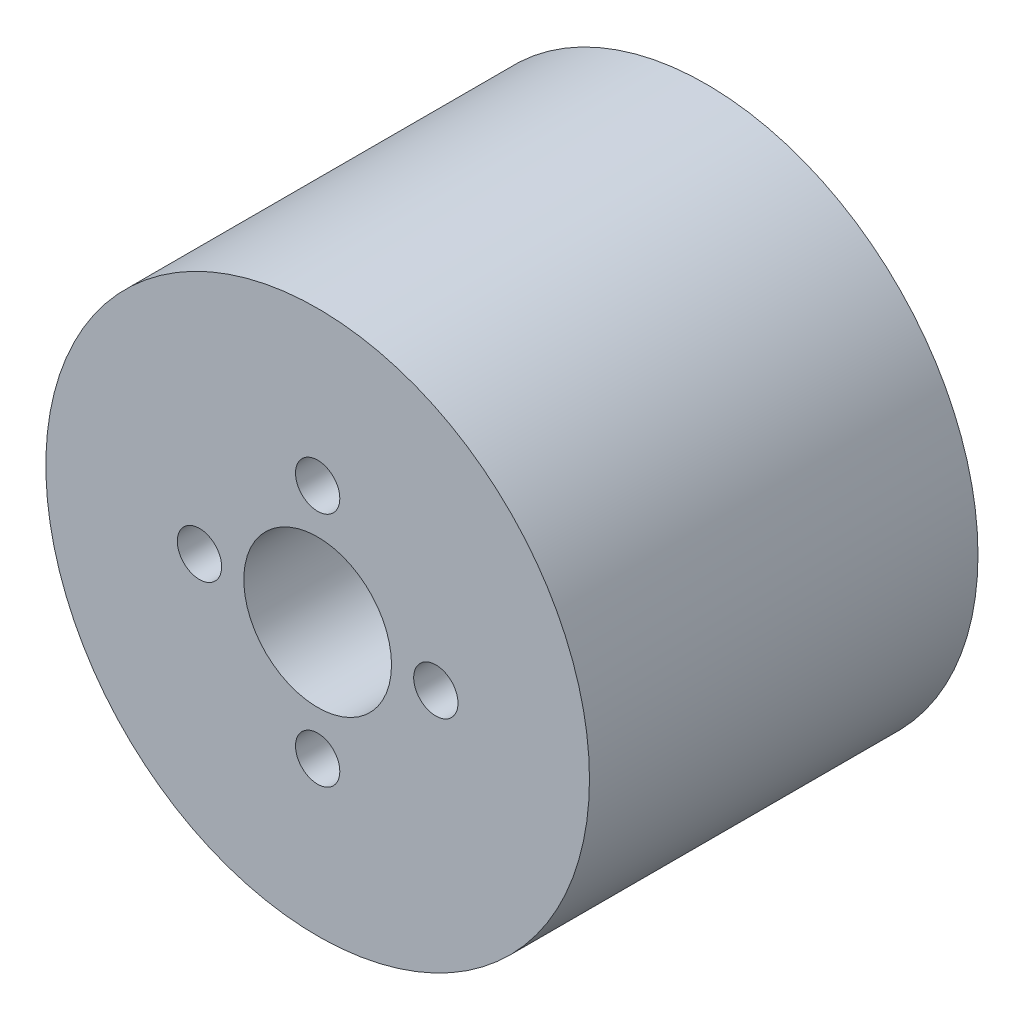
ISO-10303-21;
HEADER;
FILE_DESCRIPTION(('STEP AP214'),'2;1');
FILE_NAME('part.step','',(''),(''),'','','');
FILE_SCHEMA(('AUTOMOTIVE_DESIGN { 1 0 10303 214 1 1 1 1 }'));
ENDSEC;
DATA;
#1=APPLICATION_CONTEXT('core data for automotive mechanical design processes');
#2=APPLICATION_PROTOCOL_DEFINITION('international standard','automotive_design',2000,#1);
#3=PRODUCT_CONTEXT('',#1,'mechanical');
#4=PRODUCT('Part','Part','',(#3));
#5=PRODUCT_RELATED_PRODUCT_CATEGORY('part','',(#4));
#6=PRODUCT_DEFINITION_FORMATION('','',#4);
#7=PRODUCT_DEFINITION_CONTEXT('part definition',#1,'design');
#8=PRODUCT_DEFINITION('design','',#6,#7);
#9=PRODUCT_DEFINITION_SHAPE('','',#8);
#10=(LENGTH_UNIT() NAMED_UNIT(*) SI_UNIT(.MILLI.,.METRE.));
#11=(NAMED_UNIT(*) PLANE_ANGLE_UNIT() SI_UNIT($,.RADIAN.));
#12=(NAMED_UNIT(*) SI_UNIT($,.STERADIAN.) SOLID_ANGLE_UNIT());
#13=UNCERTAINTY_MEASURE_WITH_UNIT(LENGTH_MEASURE(1.E-05),#10,'distance_accuracy_value','');
#14=(GEOMETRIC_REPRESENTATION_CONTEXT(3) GLOBAL_UNCERTAINTY_ASSIGNED_CONTEXT((#13)) GLOBAL_UNIT_ASSIGNED_CONTEXT((#10,
#11,#12)) REPRESENTATION_CONTEXT('',''));
#15=CARTESIAN_POINT('',(0.,0.,0.));
#16=DIRECTION('',(0.,0.,1.));
#17=DIRECTION('',(1.,0.,0.));
#18=AXIS2_PLACEMENT_3D('',#15,#16,#17);
#19=CARTESIAN_POINT('',(0.,0.,26.3));
#20=DIRECTION('',(0.,0.,-1.));
#21=DIRECTION('',(-1.,0.,0.));
#22=AXIS2_PLACEMENT_3D('',#19,#20,#21);
#23=CYLINDRICAL_SURFACE('',#22,18.4);
#24=CARTESIAN_POINT('',(0.,0.,26.3));
#25=DIRECTION('',(0.,0.,1.));
#26=DIRECTION('',(1.,0.,0.));
#27=AXIS2_PLACEMENT_3D('',#24,#25,#26);
#28=CIRCLE('',#27,18.4);
#29=CARTESIAN_POINT('',(18.4,0.,26.3));
#30=VERTEX_POINT('',#29);
#31=EDGE_CURVE('E10',#30,#30,#28,.T.);
#32=ORIENTED_EDGE('',*,*,#31,.F.);
#33=EDGE_LOOP('',(#32));
#34=FACE_BOUND('',#33,.T.);
#35=CARTESIAN_POINT('',(0.,0.,0.));
#36=DIRECTION('',(0.,0.,1.));
#37=DIRECTION('',(1.,0.,0.));
#38=AXIS2_PLACEMENT_3D('',#35,#36,#37);
#39=CIRCLE('',#38,18.4);
#40=CARTESIAN_POINT('',(18.4,0.,0.));
#41=VERTEX_POINT('',#40);
#42=EDGE_CURVE('E38',#41,#41,#39,.T.);
#43=ORIENTED_EDGE('',*,*,#42,.T.);
#44=EDGE_LOOP('',(#43));
#45=FACE_BOUND('',#44,.T.);
#46=ADVANCED_FACE('F31',(#34,#45),#23,.T.);
#47=CARTESIAN_POINT('',(0.,0.,26.3));
#48=DIRECTION('',(0.,0.,1.));
#49=DIRECTION('',(1.,0.,0.));
#50=AXIS2_PLACEMENT_3D('',#47,#48,#49);
#51=PLANE('',#50);
#52=CARTESIAN_POINT('',(0.,0.,26.3));
#53=DIRECTION('',(0.,0.,1.));
#54=DIRECTION('',(1.,0.,0.));
#55=AXIS2_PLACEMENT_3D('',#52,#53,#54);
#56=CIRCLE('',#55,5.);
#57=CARTESIAN_POINT('',(5.,0.,26.3));
#58=VERTEX_POINT('',#57);
#59=EDGE_CURVE('E68',#58,#58,#56,.T.);
#60=ORIENTED_EDGE('',*,*,#59,.F.);
#61=EDGE_LOOP('',(#60));
#62=FACE_BOUND('',#61,.T.);
#63=CARTESIAN_POINT('',(0.,8.,26.3));
#64=DIRECTION('',(0.,0.,1.));
#65=DIRECTION('',(1.,0.,0.));
#66=AXIS2_PLACEMENT_3D('',#63,#64,#65);
#67=CIRCLE('',#66,1.5);
#68=CARTESIAN_POINT('',(1.5,8.,26.3));
#69=VERTEX_POINT('',#68);
#70=EDGE_CURVE('E63',#69,#69,#67,.T.);
#71=ORIENTED_EDGE('',*,*,#70,.F.);
#72=EDGE_LOOP('',(#71));
#73=FACE_BOUND('',#72,.T.);
#74=CARTESIAN_POINT('',(8.,0.,26.3));
#75=DIRECTION('',(0.,0.,1.));
#76=DIRECTION('',(1.,0.,0.));
#77=AXIS2_PLACEMENT_3D('',#74,#75,#76);
#78=CIRCLE('',#77,1.5);
#79=CARTESIAN_POINT('',(9.5,0.,26.3));
#80=VERTEX_POINT('',#79);
#81=EDGE_CURVE('E57',#80,#80,#78,.T.);
#82=ORIENTED_EDGE('',*,*,#81,.F.);
#83=EDGE_LOOP('',(#82));
#84=FACE_BOUND('',#83,.T.);
#85=CARTESIAN_POINT('',(4.52787916007828E-13,-8.,26.3));
#86=DIRECTION('',(0.,0.,1.));
#87=DIRECTION('',(1.,0.,0.));
#88=AXIS2_PLACEMENT_3D('',#85,#86,#87);
#89=CIRCLE('',#88,1.50000000000049);
#90=CARTESIAN_POINT('',(1.50000000000094,-8.,26.3));
#91=VERTEX_POINT('',#90);
#92=EDGE_CURVE('E51',#91,#91,#89,.T.);
#93=ORIENTED_EDGE('',*,*,#92,.F.);
#94=EDGE_LOOP('',(#93));
#95=FACE_BOUND('',#94,.T.);
#96=CARTESIAN_POINT('',(-8.,0.,26.3));
#97=DIRECTION('',(0.,0.,1.));
#98=DIRECTION('',(1.,0.,0.));
#99=AXIS2_PLACEMENT_3D('',#96,#97,#98);
#100=CIRCLE('',#99,1.5);
#101=CARTESIAN_POINT('',(-6.5,0.,26.3));
#102=VERTEX_POINT('',#101);
#103=EDGE_CURVE('E45',#102,#102,#100,.T.);
#104=ORIENTED_EDGE('',*,*,#103,.F.);
#105=EDGE_LOOP('',(#104));
#106=FACE_BOUND('',#105,.T.);
#107=ORIENTED_EDGE('',*,*,#31,.T.);
#108=EDGE_LOOP('',(#107));
#109=FACE_BOUND('',#108,.T.);
#110=ADVANCED_FACE('F109',(#62,#73,#84,#95,#106,#109),#51,.T.);
#111=CARTESIAN_POINT('',(0.,0.,0.));
#112=DIRECTION('',(0.,0.,1.));
#113=DIRECTION('',(1.,0.,0.));
#114=AXIS2_PLACEMENT_3D('',#111,#112,#113);
#115=PLANE('',#114);
#116=CARTESIAN_POINT('',(0.,8.,0.));
#117=DIRECTION('',(0.,0.,-1.));
#118=DIRECTION('',(-1.,0.,0.));
#119=AXIS2_PLACEMENT_3D('',#116,#117,#118);
#120=CIRCLE('',#119,1.5);
#121=CARTESIAN_POINT('',(-1.5,8.,0.));
#122=VERTEX_POINT('',#121);
#123=EDGE_CURVE('E90',#122,#122,#120,.T.);
#124=ORIENTED_EDGE('',*,*,#123,.F.);
#125=EDGE_LOOP('',(#124));
#126=FACE_BOUND('',#125,.T.);
#127=CARTESIAN_POINT('',(-8.00000000000023,2.26393958003914E-13,0.));
#128=DIRECTION('',(0.,0.,-1.));
#129=DIRECTION('',(-1.,0.,0.));
#130=AXIS2_PLACEMENT_3D('',#127,#128,#129);
#131=CIRCLE('',#130,1.50000000000018);
#132=CARTESIAN_POINT('',(-9.5000000000004,2.26393958003914E-13,0.));
#133=VERTEX_POINT('',#132);
#134=EDGE_CURVE('E84',#133,#133,#131,.T.);
#135=ORIENTED_EDGE('',*,*,#134,.F.);
#136=EDGE_LOOP('',(#135));
#137=FACE_BOUND('',#136,.T.);
#138=CARTESIAN_POINT('',(-4.52787916007828E-13,-8.,0.));
#139=DIRECTION('',(0.,0.,-1.));
#140=DIRECTION('',(-1.,0.,0.));
#141=AXIS2_PLACEMENT_3D('',#138,#139,#140);
#142=CIRCLE('',#141,1.50000000000049);
#143=CARTESIAN_POINT('',(-1.50000000000094,-8.,0.));
#144=VERTEX_POINT('',#143);
#145=EDGE_CURVE('E78',#144,#144,#142,.T.);
#146=ORIENTED_EDGE('',*,*,#145,.F.);
#147=EDGE_LOOP('',(#146));
#148=FACE_BOUND('',#147,.T.);
#149=CARTESIAN_POINT('',(7.99999999999977,-2.27373675443232E-13,0.));
#150=DIRECTION('',(0.,0.,-1.));
#151=DIRECTION('',(-1.,0.,0.));
#152=AXIS2_PLACEMENT_3D('',#149,#150,#151);
#153=CIRCLE('',#152,1.50000000000036);
#154=CARTESIAN_POINT('',(6.49999999999941,-2.27373675443232E-13,0.));
#155=VERTEX_POINT('',#154);
#156=EDGE_CURVE('E72',#155,#155,#153,.T.);
#157=ORIENTED_EDGE('',*,*,#156,.F.);
#158=EDGE_LOOP('',(#157));
#159=FACE_BOUND('',#158,.T.);
#160=CARTESIAN_POINT('',(0.,0.,0.));
#161=DIRECTION('',(0.,0.,1.));
#162=DIRECTION('',(1.,0.,0.));
#163=AXIS2_PLACEMENT_3D('',#160,#161,#162);
#164=CIRCLE('',#163,5.);
#165=CARTESIAN_POINT('',(5.,0.,0.));
#166=VERTEX_POINT('',#165);
#167=EDGE_CURVE('E34',#166,#166,#164,.T.);
#168=ORIENTED_EDGE('',*,*,#167,.T.);
#169=EDGE_LOOP('',(#168));
#170=FACE_BOUND('',#169,.T.);
#171=ORIENTED_EDGE('',*,*,#42,.F.);
#172=EDGE_LOOP('',(#171));
#173=FACE_BOUND('',#172,.T.);
#174=ADVANCED_FACE('F105',(#126,#137,#148,#159,#170,#173),#115,.F.);
#175=CARTESIAN_POINT('',(-8.,0.,23.3));
#176=DIRECTION('',(0.,0.,1.));
#177=DIRECTION('',(1.,0.,0.));
#178=AXIS2_PLACEMENT_3D('',#175,#176,#177);
#179=CYLINDRICAL_SURFACE('',#178,1.5);
#180=CARTESIAN_POINT('',(-8.,0.,23.3));
#181=DIRECTION('',(0.,0.,1.));
#182=DIRECTION('',(1.,0.,0.));
#183=AXIS2_PLACEMENT_3D('',#180,#181,#182);
#184=CIRCLE('',#183,1.5);
#185=CARTESIAN_POINT('',(-6.5,0.,23.3));
#186=VERTEX_POINT('',#185);
#187=EDGE_CURVE('E48',#186,#186,#184,.T.);
#188=ORIENTED_EDGE('',*,*,#187,.F.);
#189=EDGE_LOOP('',(#188));
#190=FACE_BOUND('',#189,.T.);
#191=ORIENTED_EDGE('',*,*,#103,.T.);
#192=EDGE_LOOP('',(#191));
#193=FACE_BOUND('',#192,.T.);
#194=ADVANCED_FACE('F108',(#190,#193),#179,.F.);
#195=CARTESIAN_POINT('',(-8.,0.,23.3));
#196=DIRECTION('',(0.,0.,1.));
#197=DIRECTION('',(1.,0.,0.));
#198=AXIS2_PLACEMENT_3D('',#195,#196,#197);
#199=PLANE('',#198);
#200=ORIENTED_EDGE('',*,*,#187,.T.);
#201=EDGE_LOOP('',(#200));
#202=FACE_BOUND('',#201,.T.);
#203=ADVANCED_FACE('F135',(#202),#199,.T.);
#204=CARTESIAN_POINT('',(4.52787916007828E-13,-8.,23.3));
#205=DIRECTION('',(0.,0.,1.));
#206=DIRECTION('',(1.,0.,0.));
#207=AXIS2_PLACEMENT_3D('',#204,#205,#206);
#208=CYLINDRICAL_SURFACE('',#207,1.50000000000049);
#209=CARTESIAN_POINT('',(4.52787916007828E-13,-8.,23.3));
#210=DIRECTION('',(0.,0.,1.));
#211=DIRECTION('',(1.,0.,0.));
#212=AXIS2_PLACEMENT_3D('',#209,#210,#211);
#213=CIRCLE('',#212,1.50000000000049);
#214=CARTESIAN_POINT('',(1.50000000000094,-8.,23.3));
#215=VERTEX_POINT('',#214);
#216=EDGE_CURVE('E54',#215,#215,#213,.T.);
#217=ORIENTED_EDGE('',*,*,#216,.F.);
#218=EDGE_LOOP('',(#217));
#219=FACE_BOUND('',#218,.T.);
#220=ORIENTED_EDGE('',*,*,#92,.T.);
#221=EDGE_LOOP('',(#220));
#222=FACE_BOUND('',#221,.T.);
#223=ADVANCED_FACE('F139',(#219,#222),#208,.F.);
#224=CARTESIAN_POINT('',(4.52787916007828E-13,-8.,23.3));
#225=DIRECTION('',(0.,0.,1.));
#226=DIRECTION('',(1.,0.,0.));
#227=AXIS2_PLACEMENT_3D('',#224,#225,#226);
#228=PLANE('',#227);
#229=ORIENTED_EDGE('',*,*,#216,.T.);
#230=EDGE_LOOP('',(#229));
#231=FACE_BOUND('',#230,.T.);
#232=ADVANCED_FACE('F143',(#231),#228,.T.);
#233=CARTESIAN_POINT('',(8.,0.,23.3));
#234=DIRECTION('',(0.,0.,1.));
#235=DIRECTION('',(1.,0.,0.));
#236=AXIS2_PLACEMENT_3D('',#233,#234,#235);
#237=CYLINDRICAL_SURFACE('',#236,1.5);
#238=CARTESIAN_POINT('',(8.,0.,23.3));
#239=DIRECTION('',(0.,0.,1.));
#240=DIRECTION('',(1.,0.,0.));
#241=AXIS2_PLACEMENT_3D('',#238,#239,#240);
#242=CIRCLE('',#241,1.5);
#243=CARTESIAN_POINT('',(9.5,0.,23.3));
#244=VERTEX_POINT('',#243);
#245=EDGE_CURVE('E60',#244,#244,#242,.T.);
#246=ORIENTED_EDGE('',*,*,#245,.F.);
#247=EDGE_LOOP('',(#246));
#248=FACE_BOUND('',#247,.T.);
#249=ORIENTED_EDGE('',*,*,#81,.T.);
#250=EDGE_LOOP('',(#249));
#251=FACE_BOUND('',#250,.T.);
#252=ADVANCED_FACE('F147',(#248,#251),#237,.F.);
#253=CARTESIAN_POINT('',(8.,0.,23.3));
#254=DIRECTION('',(0.,0.,1.));
#255=DIRECTION('',(1.,0.,0.));
#256=AXIS2_PLACEMENT_3D('',#253,#254,#255);
#257=PLANE('',#256);
#258=ORIENTED_EDGE('',*,*,#245,.T.);
#259=EDGE_LOOP('',(#258));
#260=FACE_BOUND('',#259,.T.);
#261=ADVANCED_FACE('F151',(#260),#257,.T.);
#262=CARTESIAN_POINT('',(0.,8.,23.3));
#263=DIRECTION('',(0.,0.,1.));
#264=DIRECTION('',(1.,0.,0.));
#265=AXIS2_PLACEMENT_3D('',#262,#263,#264);
#266=CYLINDRICAL_SURFACE('',#265,1.5);
#267=CARTESIAN_POINT('',(0.,8.,23.3));
#268=DIRECTION('',(0.,0.,1.));
#269=DIRECTION('',(1.,0.,0.));
#270=AXIS2_PLACEMENT_3D('',#267,#268,#269);
#271=CIRCLE('',#270,1.5);
#272=CARTESIAN_POINT('',(1.5,8.,23.3));
#273=VERTEX_POINT('',#272);
#274=EDGE_CURVE('E43',#273,#273,#271,.T.);
#275=ORIENTED_EDGE('',*,*,#274,.F.);
#276=EDGE_LOOP('',(#275));
#277=FACE_BOUND('',#276,.T.);
#278=ORIENTED_EDGE('',*,*,#70,.T.);
#279=EDGE_LOOP('',(#278));
#280=FACE_BOUND('',#279,.T.);
#281=ADVANCED_FACE('F155',(#277,#280),#266,.F.);
#282=CARTESIAN_POINT('',(0.,8.,23.3));
#283=DIRECTION('',(0.,0.,1.));
#284=DIRECTION('',(1.,0.,0.));
#285=AXIS2_PLACEMENT_3D('',#282,#283,#284);
#286=PLANE('',#285);
#287=ORIENTED_EDGE('',*,*,#274,.T.);
#288=EDGE_LOOP('',(#287));
#289=FACE_BOUND('',#288,.T.);
#290=ADVANCED_FACE('F159',(#289),#286,.T.);
#291=CARTESIAN_POINT('',(0.,0.,-17.7));
#292=DIRECTION('',(0.,0.,1.));
#293=DIRECTION('',(1.,0.,0.));
#294=AXIS2_PLACEMENT_3D('',#291,#292,#293);
#295=CYLINDRICAL_SURFACE('',#294,5.);
#296=ORIENTED_EDGE('',*,*,#59,.T.);
#297=EDGE_LOOP('',(#296));
#298=FACE_BOUND('',#297,.T.);
#299=ORIENTED_EDGE('',*,*,#167,.F.);
#300=EDGE_LOOP('',(#299));
#301=FACE_BOUND('',#300,.T.);
#302=ADVANCED_FACE('F163',(#298,#301),#295,.F.);
#303=CARTESIAN_POINT('',(7.99999999999977,-2.27373675443232E-13,3.));
#304=DIRECTION('',(0.,0.,-1.));
#305=DIRECTION('',(-1.,0.,0.));
#306=AXIS2_PLACEMENT_3D('',#303,#304,#305);
#307=CYLINDRICAL_SURFACE('',#306,1.50000000000036);
#308=CARTESIAN_POINT('',(7.99999999999977,-2.27373675443232E-13,3.));
#309=DIRECTION('',(0.,0.,-1.));
#310=DIRECTION('',(-1.,0.,0.));
#311=AXIS2_PLACEMENT_3D('',#308,#309,#310);
#312=CIRCLE('',#311,1.50000000000036);
#313=CARTESIAN_POINT('',(6.49999999999941,-2.27373675443232E-13,3.));
#314=VERTEX_POINT('',#313);
#315=EDGE_CURVE('E75',#314,#314,#312,.T.);
#316=ORIENTED_EDGE('',*,*,#315,.F.);
#317=EDGE_LOOP('',(#316));
#318=FACE_BOUND('',#317,.T.);
#319=ORIENTED_EDGE('',*,*,#156,.T.);
#320=EDGE_LOOP('',(#319));
#321=FACE_BOUND('',#320,.T.);
#322=ADVANCED_FACE('F167',(#318,#321),#307,.F.);
#323=CARTESIAN_POINT('',(7.99999999999977,-2.27373675443232E-13,3.));
#324=DIRECTION('',(0.,0.,-1.));
#325=DIRECTION('',(-1.,0.,0.));
#326=AXIS2_PLACEMENT_3D('',#323,#324,#325);
#327=PLANE('',#326);
#328=ORIENTED_EDGE('',*,*,#315,.T.);
#329=EDGE_LOOP('',(#328));
#330=FACE_BOUND('',#329,.T.);
#331=ADVANCED_FACE('F171',(#330),#327,.T.);
#332=CARTESIAN_POINT('',(-4.52787916007828E-13,-8.,3.));
#333=DIRECTION('',(0.,0.,-1.));
#334=DIRECTION('',(-1.,0.,0.));
#335=AXIS2_PLACEMENT_3D('',#332,#333,#334);
#336=CYLINDRICAL_SURFACE('',#335,1.50000000000049);
#337=CARTESIAN_POINT('',(-4.52787916007828E-13,-8.,3.));
#338=DIRECTION('',(0.,0.,-1.));
#339=DIRECTION('',(-1.,0.,0.));
#340=AXIS2_PLACEMENT_3D('',#337,#338,#339);
#341=CIRCLE('',#340,1.50000000000049);
#342=CARTESIAN_POINT('',(-1.50000000000094,-8.,3.));
#343=VERTEX_POINT('',#342);
#344=EDGE_CURVE('E81',#343,#343,#341,.T.);
#345=ORIENTED_EDGE('',*,*,#344,.F.);
#346=EDGE_LOOP('',(#345));
#347=FACE_BOUND('',#346,.T.);
#348=ORIENTED_EDGE('',*,*,#145,.T.);
#349=EDGE_LOOP('',(#348));
#350=FACE_BOUND('',#349,.T.);
#351=ADVANCED_FACE('F175',(#347,#350),#336,.F.);
#352=CARTESIAN_POINT('',(-4.52787916007828E-13,-8.,3.));
#353=DIRECTION('',(0.,0.,-1.));
#354=DIRECTION('',(-1.,0.,0.));
#355=AXIS2_PLACEMENT_3D('',#352,#353,#354);
#356=PLANE('',#355);
#357=ORIENTED_EDGE('',*,*,#344,.T.);
#358=EDGE_LOOP('',(#357));
#359=FACE_BOUND('',#358,.T.);
#360=ADVANCED_FACE('F179',(#359),#356,.T.);
#361=CARTESIAN_POINT('',(-8.00000000000023,2.26393958003914E-13,3.));
#362=DIRECTION('',(0.,0.,-1.));
#363=DIRECTION('',(-1.,0.,0.));
#364=AXIS2_PLACEMENT_3D('',#361,#362,#363);
#365=CYLINDRICAL_SURFACE('',#364,1.50000000000018);
#366=CARTESIAN_POINT('',(-8.00000000000023,2.26393958003914E-13,3.));
#367=DIRECTION('',(0.,0.,-1.));
#368=DIRECTION('',(-1.,0.,0.));
#369=AXIS2_PLACEMENT_3D('',#366,#367,#368);
#370=CIRCLE('',#369,1.50000000000018);
#371=CARTESIAN_POINT('',(-9.5000000000004,2.26393958003914E-13,3.));
#372=VERTEX_POINT('',#371);
#373=EDGE_CURVE('E87',#372,#372,#370,.T.);
#374=ORIENTED_EDGE('',*,*,#373,.F.);
#375=EDGE_LOOP('',(#374));
#376=FACE_BOUND('',#375,.T.);
#377=ORIENTED_EDGE('',*,*,#134,.T.);
#378=EDGE_LOOP('',(#377));
#379=FACE_BOUND('',#378,.T.);
#380=ADVANCED_FACE('F183',(#376,#379),#365,.F.);
#381=CARTESIAN_POINT('',(-8.00000000000023,2.26393958003914E-13,3.));
#382=DIRECTION('',(0.,0.,-1.));
#383=DIRECTION('',(-1.,0.,0.));
#384=AXIS2_PLACEMENT_3D('',#381,#382,#383);
#385=PLANE('',#384);
#386=ORIENTED_EDGE('',*,*,#373,.T.);
#387=EDGE_LOOP('',(#386));
#388=FACE_BOUND('',#387,.T.);
#389=ADVANCED_FACE('F101',(#388),#385,.T.);
#390=CARTESIAN_POINT('',(0.,8.,3.));
#391=DIRECTION('',(0.,0.,-1.));
#392=DIRECTION('',(-1.,0.,0.));
#393=AXIS2_PLACEMENT_3D('',#390,#391,#392);
#394=CYLINDRICAL_SURFACE('',#393,1.5);
#395=CARTESIAN_POINT('',(0.,8.,3.));
#396=DIRECTION('',(0.,0.,-1.));
#397=DIRECTION('',(-1.,0.,0.));
#398=AXIS2_PLACEMENT_3D('',#395,#396,#397);
#399=CIRCLE('',#398,1.5);
#400=CARTESIAN_POINT('',(-1.5,8.,3.));
#401=VERTEX_POINT('',#400);
#402=EDGE_CURVE('E71',#401,#401,#399,.T.);
#403=ORIENTED_EDGE('',*,*,#402,.F.);
#404=EDGE_LOOP('',(#403));
#405=FACE_BOUND('',#404,.T.);
#406=ORIENTED_EDGE('',*,*,#123,.T.);
#407=EDGE_LOOP('',(#406));
#408=FACE_BOUND('',#407,.T.);
#409=ADVANCED_FACE('F98',(#405,#408),#394,.F.);
#410=CARTESIAN_POINT('',(0.,8.,3.));
#411=DIRECTION('',(0.,0.,-1.));
#412=DIRECTION('',(-1.,0.,0.));
#413=AXIS2_PLACEMENT_3D('',#410,#411,#412);
#414=PLANE('',#413);
#415=ORIENTED_EDGE('',*,*,#402,.T.);
#416=EDGE_LOOP('',(#415));
#417=FACE_BOUND('',#416,.T.);
#418=ADVANCED_FACE('F96',(#417),#414,.T.);
#419=CLOSED_SHELL('',(#46,#110,#174,#194,#203,#223,#232,#252,#261,#281,#290,#302,#322,#331,#351,
#360,#380,#389,#409,#418));
#420=MANIFOLD_SOLID_BREP('B2',#419);
#421=ADVANCED_BREP_SHAPE_REPRESENTATION('',(#18,#420),#14);
#422=SHAPE_DEFINITION_REPRESENTATION(#9,#421);
ENDSEC;
END-ISO-10303-21;
